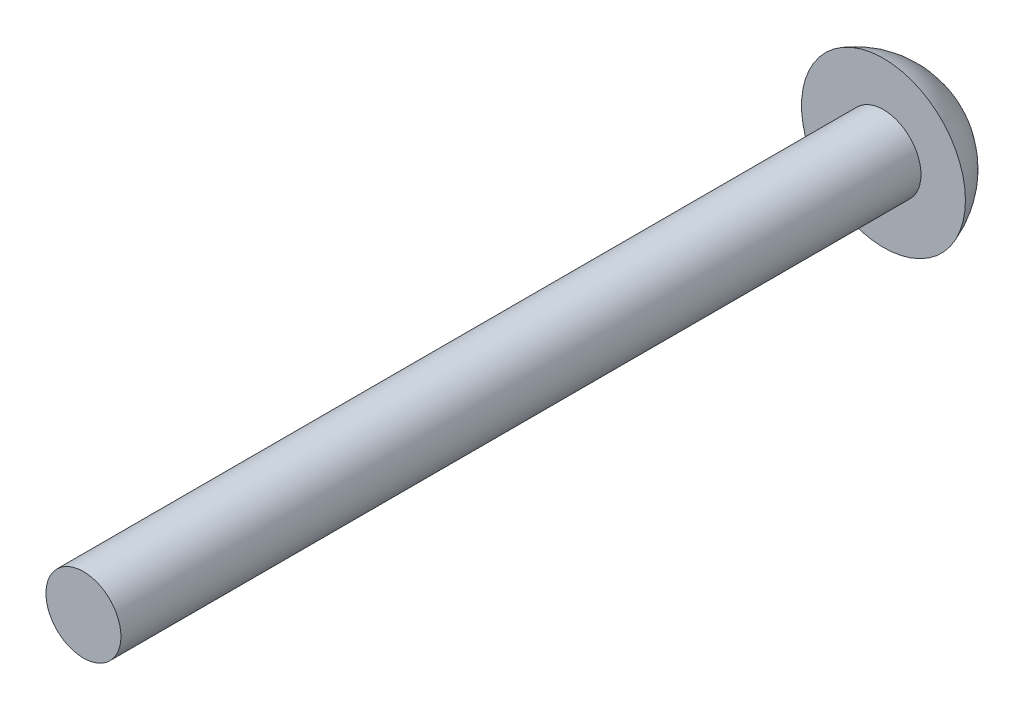
ISO-10303-21;
HEADER;
FILE_DESCRIPTION(('STEP AP214'),'2;1');
FILE_NAME('part.step','',(''),(''),'','','');
FILE_SCHEMA(('AUTOMOTIVE_DESIGN { 1 0 10303 214 1 1 1 1 }'));
ENDSEC;
DATA;
#1=APPLICATION_CONTEXT('core data for automotive mechanical design processes');
#2=APPLICATION_PROTOCOL_DEFINITION('international standard','automotive_design',2000,#1);
#3=PRODUCT_CONTEXT('',#1,'mechanical');
#4=PRODUCT('Part','Part','',(#3));
#5=PRODUCT_RELATED_PRODUCT_CATEGORY('part','',(#4));
#6=PRODUCT_DEFINITION_FORMATION('','',#4);
#7=PRODUCT_DEFINITION_CONTEXT('part definition',#1,'design');
#8=PRODUCT_DEFINITION('design','',#6,#7);
#9=PRODUCT_DEFINITION_SHAPE('','',#8);
#10=(LENGTH_UNIT() NAMED_UNIT(*) SI_UNIT(.MILLI.,.METRE.));
#11=(NAMED_UNIT(*) PLANE_ANGLE_UNIT() SI_UNIT($,.RADIAN.));
#12=(NAMED_UNIT(*) SI_UNIT($,.STERADIAN.) SOLID_ANGLE_UNIT());
#13=UNCERTAINTY_MEASURE_WITH_UNIT(LENGTH_MEASURE(1.E-05),#10,'distance_accuracy_value','');
#14=(GEOMETRIC_REPRESENTATION_CONTEXT(3) GLOBAL_UNCERTAINTY_ASSIGNED_CONTEXT((#13)) GLOBAL_UNIT_ASSIGNED_CONTEXT((#10,
#11,#12)) REPRESENTATION_CONTEXT('',''));
#15=CARTESIAN_POINT('',(0.,0.,0.));
#16=DIRECTION('',(0.,0.,1.));
#17=DIRECTION('',(1.,0.,0.));
#18=AXIS2_PLACEMENT_3D('',#15,#16,#17);
#19=CARTESIAN_POINT('',(0.,0.,16.));
#20=DIRECTION('',(0.,0.,-1.));
#21=DIRECTION('',(-1.,0.,0.));
#22=AXIS2_PLACEMENT_3D('',#19,#20,#21);
#23=CYLINDRICAL_SURFACE('',#22,0.75);
#24=CARTESIAN_POINT('',(0.,0.,16.));
#25=DIRECTION('',(0.,0.,1.));
#26=DIRECTION('',(1.,0.,0.));
#27=AXIS2_PLACEMENT_3D('',#24,#25,#26);
#28=CIRCLE('',#27,0.75);
#29=CARTESIAN_POINT('',(0.75,0.,16.));
#30=VERTEX_POINT('',#29);
#31=EDGE_CURVE('E10',#30,#30,#28,.T.);
#32=ORIENTED_EDGE('',*,*,#31,.F.);
#33=EDGE_LOOP('',(#32));
#34=FACE_BOUND('',#33,.T.);
#35=CARTESIAN_POINT('',(0.,0.,0.));
#36=DIRECTION('',(0.,0.,1.));
#37=DIRECTION('',(1.,0.,0.));
#38=AXIS2_PLACEMENT_3D('',#35,#36,#37);
#39=CIRCLE('',#38,0.75);
#40=CARTESIAN_POINT('',(0.75,0.,0.));
#41=VERTEX_POINT('',#40);
#42=EDGE_CURVE('E36',#41,#41,#39,.T.);
#43=ORIENTED_EDGE('',*,*,#42,.T.);
#44=EDGE_LOOP('',(#43));
#45=FACE_BOUND('',#44,.T.);
#46=ADVANCED_FACE('F30',(#34,#45),#23,.T.);
#47=CARTESIAN_POINT('',(0.,0.,16.));
#48=DIRECTION('',(0.,0.,1.));
#49=DIRECTION('',(1.,0.,0.));
#50=AXIS2_PLACEMENT_3D('',#47,#48,#49);
#51=PLANE('',#50);
#52=ORIENTED_EDGE('',*,*,#31,.T.);
#53=EDGE_LOOP('',(#52));
#54=FACE_BOUND('',#53,.T.);
#55=ADVANCED_FACE('F56',(#54),#51,.T.);
#56=CARTESIAN_POINT('',(0.,0.,0.));
#57=DIRECTION('',(0.,0.,1.));
#58=DIRECTION('',(1.,0.,0.));
#59=AXIS2_PLACEMENT_3D('',#56,#57,#58);
#60=PLANE('',#59);
#61=CARTESIAN_POINT('',(0.,0.,0.));
#62=DIRECTION('',(0.,0.,1.));
#63=DIRECTION('',(1.,0.,0.));
#64=AXIS2_PLACEMENT_3D('',#61,#62,#63);
#65=CIRCLE('',#64,1.63914016200939);
#66=CARTESIAN_POINT('',(1.63914016200939,0.,0.));
#67=VERTEX_POINT('',#66);
#68=EDGE_CURVE('E40',#67,#67,#65,.T.);
#69=ORIENTED_EDGE('',*,*,#68,.T.);
#70=EDGE_LOOP('',(#69));
#71=FACE_BOUND('',#70,.T.);
#72=ORIENTED_EDGE('',*,*,#42,.F.);
#73=EDGE_LOOP('',(#72));
#74=FACE_BOUND('',#73,.T.);
#75=ADVANCED_FACE('F47',(#71,#74),#60,.T.);
#76=CARTESIAN_POINT('',(0.,0.,0.557649241636101));
#77=DIRECTION('',(0.,0.,1.));
#78=DIRECTION('',(1.,0.,0.));
#79=AXIS2_PLACEMENT_3D('',#76,#77,#78);
#80=SPHERICAL_SURFACE('',#79,1.73140207560506);
#81=ORIENTED_EDGE('',*,*,#68,.F.);
#82=EDGE_LOOP('',(#81));
#83=FACE_BOUND('',#82,.T.);
#84=ADVANCED_FACE('F50',(#83),#80,.T.);
#85=CLOSED_SHELL('',(#46,#55,#75,#84));
#86=MANIFOLD_SOLID_BREP('B2',#85);
#87=ADVANCED_BREP_SHAPE_REPRESENTATION('',(#18,#86),#14);
#88=SHAPE_DEFINITION_REPRESENTATION(#9,#87);
ENDSEC;
END-ISO-10303-21;
